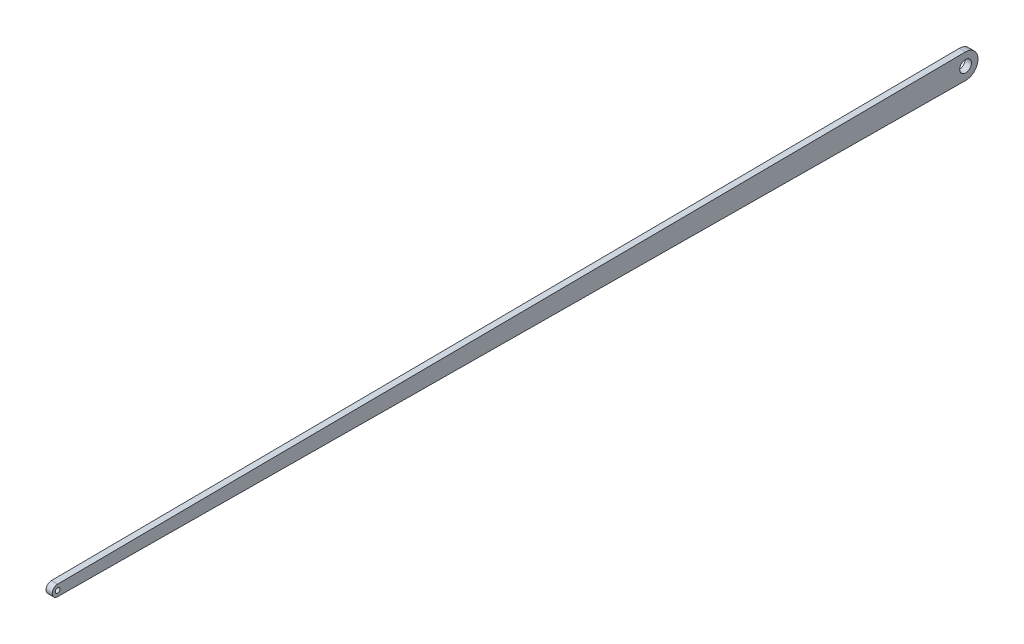
ISO-10303-21;
HEADER;
FILE_DESCRIPTION(('STEP AP214'),'2;1');
FILE_NAME('part.step','',(''),(''),'','','');
FILE_SCHEMA(('AUTOMOTIVE_DESIGN { 1 0 10303 214 1 1 1 1 }'));
ENDSEC;
DATA;
#1=APPLICATION_CONTEXT('core data for automotive mechanical design processes');
#2=APPLICATION_PROTOCOL_DEFINITION('international standard','automotive_design',2000,#1);
#3=PRODUCT_CONTEXT('',#1,'mechanical');
#4=PRODUCT('Part','Part','',(#3));
#5=PRODUCT_RELATED_PRODUCT_CATEGORY('part','',(#4));
#6=PRODUCT_DEFINITION_FORMATION('','',#4);
#7=PRODUCT_DEFINITION_CONTEXT('part definition',#1,'design');
#8=PRODUCT_DEFINITION('design','',#6,#7);
#9=PRODUCT_DEFINITION_SHAPE('','',#8);
#10=(LENGTH_UNIT() NAMED_UNIT(*) SI_UNIT(.MILLI.,.METRE.));
#11=(NAMED_UNIT(*) PLANE_ANGLE_UNIT() SI_UNIT($,.RADIAN.));
#12=(NAMED_UNIT(*) SI_UNIT($,.STERADIAN.) SOLID_ANGLE_UNIT());
#13=UNCERTAINTY_MEASURE_WITH_UNIT(LENGTH_MEASURE(1.E-05),#10,'distance_accuracy_value','');
#14=(GEOMETRIC_REPRESENTATION_CONTEXT(3) GLOBAL_UNCERTAINTY_ASSIGNED_CONTEXT((#13)) GLOBAL_UNIT_ASSIGNED_CONTEXT((#10,
#11,#12)) REPRESENTATION_CONTEXT('',''));
#15=CARTESIAN_POINT('',(0.,0.,0.));
#16=DIRECTION('',(0.,0.,1.));
#17=DIRECTION('',(1.,0.,0.));
#18=AXIS2_PLACEMENT_3D('',#15,#16,#17);
#19=CARTESIAN_POINT('',(50.,0.,0.));
#20=DIRECTION('',(1.,0.,0.));
#21=DIRECTION('',(0.,0.,-1.));
#22=AXIS2_PLACEMENT_3D('',#19,#20,#21);
#23=PLANE('',#22);
#24=CARTESIAN_POINT('',(50.,0.,0.));
#25=DIRECTION('',(1.,0.,0.));
#26=DIRECTION('',(0.,0.,-1.));
#27=AXIS2_PLACEMENT_3D('',#24,#25,#26);
#28=CIRCLE('',#27,46.875);
#29=CARTESIAN_POINT('',(50.,0.,-46.875));
#30=VERTEX_POINT('',#29);
#31=EDGE_CURVE('E102',#30,#30,#28,.T.);
#32=ORIENTED_EDGE('',*,*,#31,.F.);
#33=EDGE_LOOP('',(#32));
#34=FACE_BOUND('',#33,.T.);
#35=CARTESIAN_POINT('',(50.,0.,0.));
#36=DIRECTION('',(1.,0.,0.));
#37=DIRECTION('',(0.,0.,-1.));
#38=AXIS2_PLACEMENT_3D('',#35,#36,#37);
#39=CIRCLE('',#38,100.);
#40=CARTESIAN_POINT('',(50.,-100.,1.05873922254841E-13));
#41=VERTEX_POINT('',#40);
#42=CARTESIAN_POINT('',(50.,100.,1.05873922254841E-13));
#43=VERTEX_POINT('',#42);
#44=EDGE_CURVE('E87',#41,#43,#39,.T.);
#45=ORIENTED_EDGE('',*,*,#44,.T.);
#46=DIRECTION('',(0.,-0.00770525070807884,0.999970314115137));
#47=VECTOR('',#46,1.);
#48=CARTESIAN_POINT('',(50.,100.,1.05873922254841E-13));
#49=LINE('',#48,#47);
#50=CARTESIAN_POINT('',(50.,43.75,7300.));
#51=VERTEX_POINT('',#50);
#52=EDGE_CURVE('E82',#43,#51,#49,.T.);
#53=ORIENTED_EDGE('',*,*,#52,.T.);
#54=CARTESIAN_POINT('',(50.,-8.93992163377568E-13,7300.));
#55=DIRECTION('',(1.,0.,0.));
#56=DIRECTION('',(0.,0.,-1.));
#57=AXIS2_PLACEMENT_3D('',#54,#55,#56);
#58=CIRCLE('',#57,43.7500000000009);
#59=CARTESIAN_POINT('',(50.,-43.7500000000009,7300.));
#60=VERTEX_POINT('',#59);
#61=EDGE_CURVE('E85',#51,#60,#58,.T.);
#62=ORIENTED_EDGE('',*,*,#61,.T.);
#63=DIRECTION('',(0.,-0.00770525070807884,-0.999970314115137));
#64=VECTOR('',#63,1.);
#65=CARTESIAN_POINT('',(50.,-43.7500000000009,7300.));
#66=LINE('',#65,#64);
#67=EDGE_CURVE('E52',#60,#41,#66,.T.);
#68=ORIENTED_EDGE('',*,*,#67,.T.);
#69=EDGE_LOOP('',(#45,#53,#62,#68));
#70=FACE_BOUND('',#69,.T.);
#71=CARTESIAN_POINT('',(50.,-8.93992163377568E-13,7300.));
#72=DIRECTION('',(1.,0.,0.));
#73=DIRECTION('',(0.,0.,-1.));
#74=AXIS2_PLACEMENT_3D('',#71,#72,#73);
#75=CIRCLE('',#74,18.7500000000001);
#76=CARTESIAN_POINT('',(50.,-8.93992163377568E-13,7281.25));
#77=VERTEX_POINT('',#76);
#78=EDGE_CURVE('E117',#77,#77,#75,.T.);
#79=ORIENTED_EDGE('',*,*,#78,.F.);
#80=EDGE_LOOP('',(#79));
#81=FACE_BOUND('',#80,.T.);
#82=ADVANCED_FACE('F35',(#34,#70,#81),#23,.T.);
#83=CARTESIAN_POINT('',(0.,0.,0.));
#84=DIRECTION('',(1.,0.,0.));
#85=DIRECTION('',(0.,0.,-1.));
#86=AXIS2_PLACEMENT_3D('',#83,#84,#85);
#87=PLANE('',#86);
#88=CARTESIAN_POINT('',(0.,0.,0.));
#89=DIRECTION('',(1.,0.,0.));
#90=DIRECTION('',(0.,0.,-1.));
#91=AXIS2_PLACEMENT_3D('',#88,#89,#90);
#92=CIRCLE('',#91,46.875);
#93=CARTESIAN_POINT('',(0.,0.,-46.875));
#94=VERTEX_POINT('',#93);
#95=EDGE_CURVE('E114',#94,#94,#92,.T.);
#96=ORIENTED_EDGE('',*,*,#95,.T.);
#97=EDGE_LOOP('',(#96));
#98=FACE_BOUND('',#97,.T.);
#99=CARTESIAN_POINT('',(0.,0.,0.));
#100=DIRECTION('',(1.,0.,0.));
#101=DIRECTION('',(0.,0.,-1.));
#102=AXIS2_PLACEMENT_3D('',#99,#100,#101);
#103=CIRCLE('',#102,100.);
#104=CARTESIAN_POINT('',(0.,-100.,1.05873922254841E-13));
#105=VERTEX_POINT('',#104);
#106=CARTESIAN_POINT('',(0.,100.,1.05873922254841E-13));
#107=VERTEX_POINT('',#106);
#108=EDGE_CURVE('E99',#105,#107,#103,.T.);
#109=ORIENTED_EDGE('',*,*,#108,.F.);
#110=DIRECTION('',(0.,-0.00770525070807884,-0.999970314115137));
#111=VECTOR('',#110,1.);
#112=CARTESIAN_POINT('',(0.,-43.7500000000009,7300.));
#113=LINE('',#112,#111);
#114=CARTESIAN_POINT('',(0.,-43.7500000000009,7300.));
#115=VERTEX_POINT('',#114);
#116=EDGE_CURVE('E75',#115,#105,#113,.T.);
#117=ORIENTED_EDGE('',*,*,#116,.F.);
#118=CARTESIAN_POINT('',(0.,-8.93992163377568E-13,7300.));
#119=DIRECTION('',(1.,0.,0.));
#120=DIRECTION('',(0.,0.,-1.));
#121=AXIS2_PLACEMENT_3D('',#118,#119,#120);
#122=CIRCLE('',#121,43.7500000000009);
#123=CARTESIAN_POINT('',(0.,43.75,7300.));
#124=VERTEX_POINT('',#123);
#125=EDGE_CURVE('E69',#124,#115,#122,.T.);
#126=ORIENTED_EDGE('',*,*,#125,.F.);
#127=DIRECTION('',(0.,-0.00770525070807884,0.999970314115137));
#128=VECTOR('',#127,1.);
#129=CARTESIAN_POINT('',(0.,100.,1.05873922254841E-13));
#130=LINE('',#129,#128);
#131=EDGE_CURVE('E91',#107,#124,#130,.T.);
#132=ORIENTED_EDGE('',*,*,#131,.F.);
#133=EDGE_LOOP('',(#109,#117,#126,#132));
#134=FACE_BOUND('',#133,.T.);
#135=CARTESIAN_POINT('',(0.,-8.93992163377568E-13,7300.));
#136=DIRECTION('',(1.,0.,0.));
#137=DIRECTION('',(0.,0.,-1.));
#138=AXIS2_PLACEMENT_3D('',#135,#136,#137);
#139=CIRCLE('',#138,18.7500000000001);
#140=CARTESIAN_POINT('',(0.,-8.93992163377568E-13,7281.25));
#141=VERTEX_POINT('',#140);
#142=EDGE_CURVE('E120',#141,#141,#139,.T.);
#143=ORIENTED_EDGE('',*,*,#142,.T.);
#144=EDGE_LOOP('',(#143));
#145=FACE_BOUND('',#144,.T.);
#146=ADVANCED_FACE('F110',(#98,#134,#145),#87,.F.);
#147=CARTESIAN_POINT('',(50.,0.,0.));
#148=DIRECTION('',(-1.,0.,0.));
#149=DIRECTION('',(0.,0.,1.));
#150=AXIS2_PLACEMENT_3D('',#147,#148,#149);
#151=CYLINDRICAL_SURFACE('',#150,100.);
#152=ORIENTED_EDGE('',*,*,#108,.T.);
#153=DIRECTION('',(-1.,0.,0.));
#154=VECTOR('',#153,1.);
#155=CARTESIAN_POINT('',(50.,100.,1.05873922254841E-13));
#156=LINE('',#155,#154);
#157=EDGE_CURVE('E11',#43,#107,#156,.T.);
#158=ORIENTED_EDGE('',*,*,#157,.F.);
#159=ORIENTED_EDGE('',*,*,#44,.F.);
#160=DIRECTION('',(-1.,0.,0.));
#161=VECTOR('',#160,1.);
#162=CARTESIAN_POINT('',(50.,-100.,1.05873922254841E-13));
#163=LINE('',#162,#161);
#164=EDGE_CURVE('E95',#41,#105,#163,.T.);
#165=ORIENTED_EDGE('',*,*,#164,.T.);
#166=EDGE_LOOP('',(#152,#158,#159,#165));
#167=FACE_BOUND('',#166,.T.);
#168=ADVANCED_FACE('F37',(#167),#151,.T.);
#169=CARTESIAN_POINT('',(50.,100.,1.05873922254841E-13));
#170=DIRECTION('',(0.,-0.999970314115137,-0.00770525070807884));
#171=DIRECTION('',(0.,0.00770525070807884,-0.999970314115137));
#172=AXIS2_PLACEMENT_3D('',#169,#170,#171);
#173=PLANE('',#172);
#174=ORIENTED_EDGE('',*,*,#131,.T.);
#175=DIRECTION('',(-1.,0.,0.));
#176=VECTOR('',#175,1.);
#177=CARTESIAN_POINT('',(50.,43.75,7300.));
#178=LINE('',#177,#176);
#179=EDGE_CURVE('E44',#51,#124,#178,.T.);
#180=ORIENTED_EDGE('',*,*,#179,.F.);
#181=ORIENTED_EDGE('',*,*,#52,.F.);
#182=ORIENTED_EDGE('',*,*,#157,.T.);
#183=EDGE_LOOP('',(#174,#180,#181,#182));
#184=FACE_BOUND('',#183,.T.);
#185=ADVANCED_FACE('F90',(#184),#173,.F.);
#186=CARTESIAN_POINT('',(50.,-8.93992163377568E-13,7300.));
#187=DIRECTION('',(-1.,0.,0.));
#188=DIRECTION('',(0.,0.,1.));
#189=AXIS2_PLACEMENT_3D('',#186,#187,#188);
#190=CYLINDRICAL_SURFACE('',#189,43.7500000000009);
#191=ORIENTED_EDGE('',*,*,#125,.T.);
#192=DIRECTION('',(-1.,0.,0.));
#193=VECTOR('',#192,1.);
#194=CARTESIAN_POINT('',(50.,-43.7500000000009,7300.));
#195=LINE('',#194,#193);
#196=EDGE_CURVE('E92',#60,#115,#195,.T.);
#197=ORIENTED_EDGE('',*,*,#196,.F.);
#198=ORIENTED_EDGE('',*,*,#61,.F.);
#199=ORIENTED_EDGE('',*,*,#179,.T.);
#200=EDGE_LOOP('',(#191,#197,#198,#199));
#201=FACE_BOUND('',#200,.T.);
#202=ADVANCED_FACE('F93',(#201),#190,.T.);
#203=CARTESIAN_POINT('',(50.,-43.7500000000009,7300.));
#204=DIRECTION('',(0.,0.999970314115137,-0.00770525070807884));
#205=DIRECTION('',(0.,0.00770525070807884,0.999970314115137));
#206=AXIS2_PLACEMENT_3D('',#203,#204,#205);
#207=PLANE('',#206);
#208=ORIENTED_EDGE('',*,*,#116,.T.);
#209=ORIENTED_EDGE('',*,*,#164,.F.);
#210=ORIENTED_EDGE('',*,*,#67,.F.);
#211=ORIENTED_EDGE('',*,*,#196,.T.);
#212=EDGE_LOOP('',(#208,#209,#210,#211));
#213=FACE_BOUND('',#212,.T.);
#214=ADVANCED_FACE('F107',(#213),#207,.F.);
#215=CARTESIAN_POINT('',(50.,0.,0.));
#216=DIRECTION('',(-1.,0.,0.));
#217=DIRECTION('',(0.,0.,1.));
#218=AXIS2_PLACEMENT_3D('',#215,#216,#217);
#219=CYLINDRICAL_SURFACE('',#218,46.875);
#220=ORIENTED_EDGE('',*,*,#31,.T.);
#221=EDGE_LOOP('',(#220));
#222=FACE_BOUND('',#221,.T.);
#223=ORIENTED_EDGE('',*,*,#95,.F.);
#224=EDGE_LOOP('',(#223));
#225=FACE_BOUND('',#224,.T.);
#226=ADVANCED_FACE('F138',(#222,#225),#219,.F.);
#227=CARTESIAN_POINT('',(50.,-8.93992163377568E-13,7300.));
#228=DIRECTION('',(-1.,0.,0.));
#229=DIRECTION('',(0.,0.,1.));
#230=AXIS2_PLACEMENT_3D('',#227,#228,#229);
#231=CYLINDRICAL_SURFACE('',#230,18.7500000000001);
#232=ORIENTED_EDGE('',*,*,#78,.T.);
#233=EDGE_LOOP('',(#232));
#234=FACE_BOUND('',#233,.T.);
#235=ORIENTED_EDGE('',*,*,#142,.F.);
#236=EDGE_LOOP('',(#235));
#237=FACE_BOUND('',#236,.T.);
#238=ADVANCED_FACE('F126',(#234,#237),#231,.F.);
#239=CLOSED_SHELL('',(#82,#146,#168,#185,#202,#214,#226,#238));
#240=MANIFOLD_SOLID_BREP('B2',#239);
#241=ADVANCED_BREP_SHAPE_REPRESENTATION('',(#18,#240),#14);
#242=SHAPE_DEFINITION_REPRESENTATION(#9,#241);
ENDSEC;
END-ISO-10303-21;
